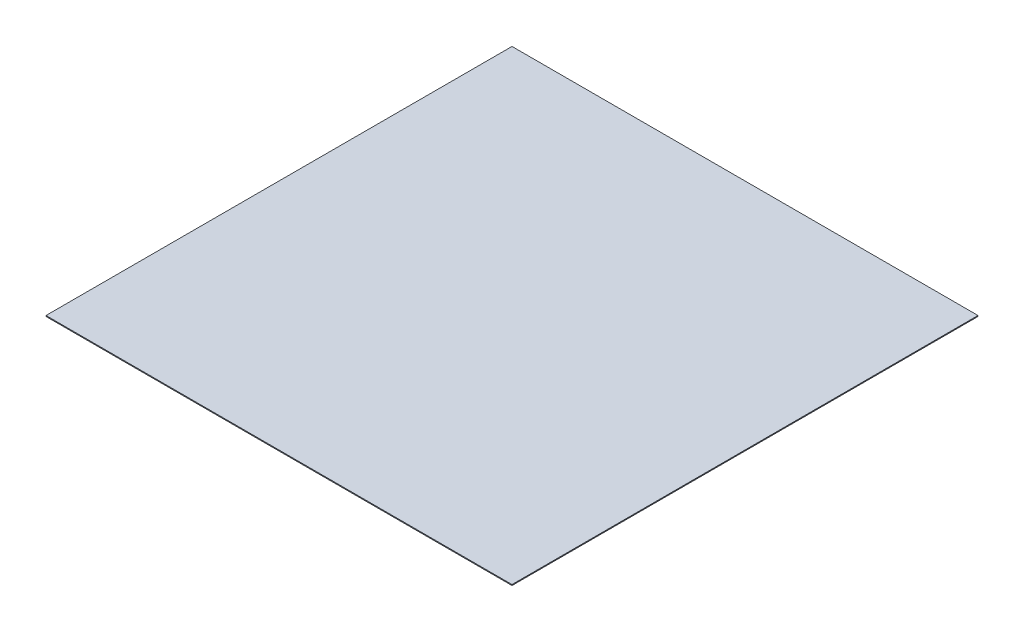
ISO-10303-21;
HEADER;
FILE_DESCRIPTION(('STEP AP214'),'2;1');
FILE_NAME('part.step','',(''),(''),'','','');
FILE_SCHEMA(('AUTOMOTIVE_DESIGN { 1 0 10303 214 1 1 1 1 }'));
ENDSEC;
DATA;
#1=APPLICATION_CONTEXT('core data for automotive mechanical design processes');
#2=APPLICATION_PROTOCOL_DEFINITION('international standard','automotive_design',2000,#1);
#3=PRODUCT_CONTEXT('',#1,'mechanical');
#4=PRODUCT('Part','Part','',(#3));
#5=PRODUCT_RELATED_PRODUCT_CATEGORY('part','',(#4));
#6=PRODUCT_DEFINITION_FORMATION('','',#4);
#7=PRODUCT_DEFINITION_CONTEXT('part definition',#1,'design');
#8=PRODUCT_DEFINITION('design','',#6,#7);
#9=PRODUCT_DEFINITION_SHAPE('','',#8);
#10=(LENGTH_UNIT() NAMED_UNIT(*) SI_UNIT(.MILLI.,.METRE.));
#11=(NAMED_UNIT(*) PLANE_ANGLE_UNIT() SI_UNIT($,.RADIAN.));
#12=(NAMED_UNIT(*) SI_UNIT($,.STERADIAN.) SOLID_ANGLE_UNIT());
#13=UNCERTAINTY_MEASURE_WITH_UNIT(LENGTH_MEASURE(1.E-05),#10,'distance_accuracy_value','');
#14=(GEOMETRIC_REPRESENTATION_CONTEXT(3) GLOBAL_UNCERTAINTY_ASSIGNED_CONTEXT((#13)) GLOBAL_UNIT_ASSIGNED_CONTEXT((#10,
#11,#12)) REPRESENTATION_CONTEXT('',''));
#15=CARTESIAN_POINT('',(0.,0.,0.));
#16=DIRECTION('',(0.,0.,1.));
#17=DIRECTION('',(1.,0.,0.));
#18=AXIS2_PLACEMENT_3D('',#15,#16,#17);
#19=CARTESIAN_POINT('',(26.,0.1,-26.));
#20=DIRECTION('',(-1.,0.,0.));
#21=DIRECTION('',(0.,0.,1.));
#22=AXIS2_PLACEMENT_3D('',#19,#20,#21);
#23=PLANE('',#22);
#24=DIRECTION('',(0.,0.,-1.));
#25=VECTOR('',#24,1.);
#26=CARTESIAN_POINT('',(26.,0.,-26.));
#27=LINE('',#26,#25);
#28=CARTESIAN_POINT('',(26.,0.,26.));
#29=VERTEX_POINT('',#28);
#30=CARTESIAN_POINT('',(26.,0.,-26.));
#31=VERTEX_POINT('',#30);
#32=EDGE_CURVE('E101',#29,#31,#27,.T.);
#33=ORIENTED_EDGE('',*,*,#32,.T.);
#34=DIRECTION('',(0.,-1.,0.));
#35=VECTOR('',#34,1.);
#36=CARTESIAN_POINT('',(26.,0.1,-26.));
#37=LINE('',#36,#35);
#38=CARTESIAN_POINT('',(26.,0.1,-26.));
#39=VERTEX_POINT('',#38);
#40=EDGE_CURVE('E11',#39,#31,#37,.T.);
#41=ORIENTED_EDGE('',*,*,#40,.F.);
#42=DIRECTION('',(0.,0.,-1.));
#43=VECTOR('',#42,1.);
#44=CARTESIAN_POINT('',(26.,0.1,-26.));
#45=LINE('',#44,#43);
#46=CARTESIAN_POINT('',(26.,0.1,26.));
#47=VERTEX_POINT('',#46);
#48=EDGE_CURVE('E89',#47,#39,#45,.T.);
#49=ORIENTED_EDGE('',*,*,#48,.F.);
#50=DIRECTION('',(0.,-1.,0.));
#51=VECTOR('',#50,1.);
#52=CARTESIAN_POINT('',(26.,0.1,26.));
#53=LINE('',#52,#51);
#54=EDGE_CURVE('E97',#47,#29,#53,.T.);
#55=ORIENTED_EDGE('',*,*,#54,.T.);
#56=EDGE_LOOP('',(#33,#41,#49,#55));
#57=FACE_BOUND('',#56,.T.);
#58=ADVANCED_FACE('F38',(#57),#23,.F.);
#59=CARTESIAN_POINT('',(-26.,0.1,-26.));
#60=DIRECTION('',(0.,0.,1.));
#61=DIRECTION('',(1.,0.,0.));
#62=AXIS2_PLACEMENT_3D('',#59,#60,#61);
#63=PLANE('',#62);
#64=DIRECTION('',(-1.,0.,0.));
#65=VECTOR('',#64,1.);
#66=CARTESIAN_POINT('',(-26.,0.,-26.));
#67=LINE('',#66,#65);
#68=CARTESIAN_POINT('',(-26.,0.,-26.));
#69=VERTEX_POINT('',#68);
#70=EDGE_CURVE('E93',#31,#69,#67,.T.);
#71=ORIENTED_EDGE('',*,*,#70,.T.);
#72=DIRECTION('',(0.,-1.,0.));
#73=VECTOR('',#72,1.);
#74=CARTESIAN_POINT('',(-26.,0.1,-26.));
#75=LINE('',#74,#73);
#76=CARTESIAN_POINT('',(-26.,0.1,-26.));
#77=VERTEX_POINT('',#76);
#78=EDGE_CURVE('E46',#77,#69,#75,.T.);
#79=ORIENTED_EDGE('',*,*,#78,.F.);
#80=DIRECTION('',(-1.,0.,0.));
#81=VECTOR('',#80,1.);
#82=CARTESIAN_POINT('',(-26.,0.1,-26.));
#83=LINE('',#82,#81);
#84=EDGE_CURVE('E84',#39,#77,#83,.T.);
#85=ORIENTED_EDGE('',*,*,#84,.F.);
#86=ORIENTED_EDGE('',*,*,#40,.T.);
#87=EDGE_LOOP('',(#71,#79,#85,#86));
#88=FACE_BOUND('',#87,.T.);
#89=ADVANCED_FACE('F92',(#88),#63,.F.);
#90=CARTESIAN_POINT('',(-26.,0.1,-26.));
#91=DIRECTION('',(1.,0.,0.));
#92=DIRECTION('',(0.,0.,-1.));
#93=AXIS2_PLACEMENT_3D('',#90,#91,#92);
#94=PLANE('',#93);
#95=DIRECTION('',(0.,0.,1.));
#96=VECTOR('',#95,1.);
#97=CARTESIAN_POINT('',(-26.,0.,-26.));
#98=LINE('',#97,#96);
#99=CARTESIAN_POINT('',(-26.,0.,26.));
#100=VERTEX_POINT('',#99);
#101=EDGE_CURVE('E71',#69,#100,#98,.T.);
#102=ORIENTED_EDGE('',*,*,#101,.T.);
#103=DIRECTION('',(0.,-1.,0.));
#104=VECTOR('',#103,1.);
#105=CARTESIAN_POINT('',(-26.,0.1,26.));
#106=LINE('',#105,#104);
#107=CARTESIAN_POINT('',(-26.,0.1,26.));
#108=VERTEX_POINT('',#107);
#109=EDGE_CURVE('E94',#108,#100,#106,.T.);
#110=ORIENTED_EDGE('',*,*,#109,.F.);
#111=DIRECTION('',(0.,0.,1.));
#112=VECTOR('',#111,1.);
#113=CARTESIAN_POINT('',(-26.,0.1,-26.));
#114=LINE('',#113,#112);
#115=EDGE_CURVE('E87',#77,#108,#114,.T.);
#116=ORIENTED_EDGE('',*,*,#115,.F.);
#117=ORIENTED_EDGE('',*,*,#78,.T.);
#118=EDGE_LOOP('',(#102,#110,#116,#117));
#119=FACE_BOUND('',#118,.T.);
#120=ADVANCED_FACE('F95',(#119),#94,.F.);
#121=CARTESIAN_POINT('',(-26.,0.1,26.));
#122=DIRECTION('',(0.,0.,-1.));
#123=DIRECTION('',(-1.,0.,0.));
#124=AXIS2_PLACEMENT_3D('',#121,#122,#123);
#125=PLANE('',#124);
#126=DIRECTION('',(1.,0.,0.));
#127=VECTOR('',#126,1.);
#128=CARTESIAN_POINT('',(-26.,0.,26.));
#129=LINE('',#128,#127);
#130=EDGE_CURVE('E77',#100,#29,#129,.T.);
#131=ORIENTED_EDGE('',*,*,#130,.T.);
#132=ORIENTED_EDGE('',*,*,#54,.F.);
#133=DIRECTION('',(1.,0.,0.));
#134=VECTOR('',#133,1.);
#135=CARTESIAN_POINT('',(-26.,0.1,26.));
#136=LINE('',#135,#134);
#137=EDGE_CURVE('E54',#108,#47,#136,.T.);
#138=ORIENTED_EDGE('',*,*,#137,.F.);
#139=ORIENTED_EDGE('',*,*,#109,.T.);
#140=EDGE_LOOP('',(#131,#132,#138,#139));
#141=FACE_BOUND('',#140,.T.);
#142=ADVANCED_FACE('F108',(#141),#125,.F.);
#143=CARTESIAN_POINT('',(0.,0.1,0.));
#144=DIRECTION('',(0.,1.,0.));
#145=DIRECTION('',(0.,0.,1.));
#146=AXIS2_PLACEMENT_3D('',#143,#144,#145);
#147=PLANE('',#146);
#148=ORIENTED_EDGE('',*,*,#48,.T.);
#149=ORIENTED_EDGE('',*,*,#84,.T.);
#150=ORIENTED_EDGE('',*,*,#115,.T.);
#151=ORIENTED_EDGE('',*,*,#137,.T.);
#152=EDGE_LOOP('',(#148,#149,#150,#151));
#153=FACE_BOUND('',#152,.T.);
#154=ADVANCED_FACE('F85',(#153),#147,.T.);
#155=CARTESIAN_POINT('',(0.,0.,0.));
#156=DIRECTION('',(0.,1.,0.));
#157=DIRECTION('',(0.,0.,1.));
#158=AXIS2_PLACEMENT_3D('',#155,#156,#157);
#159=PLANE('',#158);
#160=ORIENTED_EDGE('',*,*,#32,.F.);
#161=ORIENTED_EDGE('',*,*,#130,.F.);
#162=ORIENTED_EDGE('',*,*,#101,.F.);
#163=ORIENTED_EDGE('',*,*,#70,.F.);
#164=EDGE_LOOP('',(#160,#161,#162,#163));
#165=FACE_BOUND('',#164,.T.);
#166=ADVANCED_FACE('F111',(#165),#159,.F.);
#167=CLOSED_SHELL('',(#58,#89,#120,#142,#154,#166));
#168=MANIFOLD_SOLID_BREP('B2',#167);
#169=ADVANCED_BREP_SHAPE_REPRESENTATION('',(#18,#168),#14);
#170=SHAPE_DEFINITION_REPRESENTATION(#9,#169);
ENDSEC;
END-ISO-10303-21;
